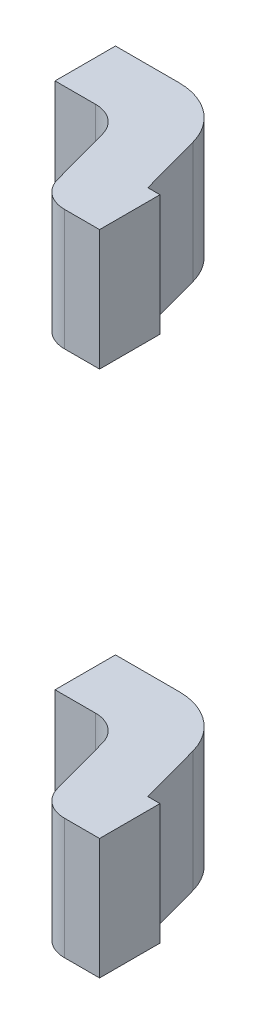
ISO-10303-21;
HEADER;
FILE_DESCRIPTION(('STEP AP214'),'2;1');
FILE_NAME('part.step','',(''),(''),'','','');
FILE_SCHEMA(('AUTOMOTIVE_DESIGN { 1 0 10303 214 1 1 1 1 }'));
ENDSEC;
DATA;
#1=APPLICATION_CONTEXT('core data for automotive mechanical design processes');
#2=APPLICATION_PROTOCOL_DEFINITION('international standard','automotive_design',2000,#1);
#3=PRODUCT_CONTEXT('',#1,'mechanical');
#4=PRODUCT('Part','Part','',(#3));
#5=PRODUCT_RELATED_PRODUCT_CATEGORY('part','',(#4));
#6=PRODUCT_DEFINITION_FORMATION('','',#4);
#7=PRODUCT_DEFINITION_CONTEXT('part definition',#1,'design');
#8=PRODUCT_DEFINITION('design','',#6,#7);
#9=PRODUCT_DEFINITION_SHAPE('','',#8);
#10=(LENGTH_UNIT() NAMED_UNIT(*) SI_UNIT(.MILLI.,.METRE.));
#11=(NAMED_UNIT(*) PLANE_ANGLE_UNIT() SI_UNIT($,.RADIAN.));
#12=(NAMED_UNIT(*) SI_UNIT($,.STERADIAN.) SOLID_ANGLE_UNIT());
#13=UNCERTAINTY_MEASURE_WITH_UNIT(LENGTH_MEASURE(1.E-05),#10,'distance_accuracy_value','');
#14=(GEOMETRIC_REPRESENTATION_CONTEXT(3) GLOBAL_UNCERTAINTY_ASSIGNED_CONTEXT((#13)) GLOBAL_UNIT_ASSIGNED_CONTEXT((#10,
#11,#12)) REPRESENTATION_CONTEXT('',''));
#15=CARTESIAN_POINT('',(0.,0.,0.));
#16=DIRECTION('',(0.,0.,1.));
#17=DIRECTION('',(1.,0.,0.));
#18=AXIS2_PLACEMENT_3D('',#15,#16,#17);
#19=CARTESIAN_POINT('',(-0.898916234097,-1.18,0.269792734049));
#20=DIRECTION('',(0.,-1.,0.));
#21=DIRECTION('',(1.,0.,0.));
#22=AXIS2_PLACEMENT_3D('',#19,#20,#21);
#23=PLANE('',#22);
#24=DIRECTION('',(1.,0.,0.));
#25=VECTOR('',#24,1.);
#26=CARTESIAN_POINT('',(-1.2,-1.18,0.22));
#27=LINE('',#26,#25);
#28=CARTESIAN_POINT('',(-1.2,-1.18,0.22));
#29=VERTEX_POINT('',#28);
#30=CARTESIAN_POINT('',(-1.05205262753,-1.18,0.22));
#31=VERTEX_POINT('',#30);
#32=EDGE_CURVE('P0_E86',#29,#31,#27,.T.);
#33=ORIENTED_EDGE('',*,*,#32,.F.);
#34=DIRECTION('',(0.,0.,-1.));
#35=VECTOR('',#34,1.);
#36=CARTESIAN_POINT('',(-1.2,-1.18,0.));
#37=LINE('',#36,#35);
#38=CARTESIAN_POINT('',(-1.2,-1.18,0.));
#39=VERTEX_POINT('',#38);
#40=EDGE_CURVE('P0_E92',#29,#39,#37,.T.);
#41=ORIENTED_EDGE('',*,*,#40,.T.);
#42=DIRECTION('',(1.,0.,0.));
#43=VECTOR('',#42,1.);
#44=CARTESIAN_POINT('',(-1.2,-1.18,0.));
#45=LINE('',#44,#43);
#46=CARTESIAN_POINT('',(-0.96803508502,-1.18,0.));
#47=VERTEX_POINT('',#46);
#48=EDGE_CURVE('P0_E178',#39,#47,#45,.T.);
#49=ORIENTED_EDGE('',*,*,#48,.T.);
#50=CARTESIAN_POINT('',(-0.96803508502,-1.18,0.22));
#51=DIRECTION('',(0.,1.,0.));
#52=DIRECTION('',(0.,0.,1.));
#53=AXIS2_PLACEMENT_3D('',#50,#51,#52);
#54=CIRCLE('',#53,0.22);
#55=CARTESIAN_POINT('',(-0.755787044347605,-1.18,0.162114170725821));
#56=VERTEX_POINT('',#55);
#57=EDGE_CURVE('P0_E204',#56,#47,#54,.T.);
#58=ORIENTED_EDGE('',*,*,#57,.F.);
#59=DIRECTION('',(-0.26311740579194,0.,-0.964763821237778));
#60=VECTOR('',#59,1.);
#61=CARTESIAN_POINT('',(-0.8,-1.18,0.));
#62=LINE('',#61,#60);
#63=CARTESIAN_POINT('',(-0.694212955652576,-1.18,0.387885829274105));
#64=VERTEX_POINT('',#63);
#65=EDGE_CURVE('P0_E121',#64,#56,#62,.T.);
#66=ORIENTED_EDGE('',*,*,#65,.F.);
#67=DIRECTION('',(1.,0.,0.));
#68=VECTOR('',#67,1.);
#69=CARTESIAN_POINT('',(-0.862248040672,-1.18,0.387885829274));
#70=LINE('',#69,#68);
#71=CARTESIAN_POINT('',(-0.65,-1.18,0.387885829274));
#72=VERTEX_POINT('',#71);
#73=EDGE_CURVE('P0_E122',#64,#72,#70,.T.);
#74=ORIENTED_EDGE('',*,*,#73,.T.);
#75=DIRECTION('',(0.,0.,-1.));
#76=VECTOR('',#75,1.);
#77=CARTESIAN_POINT('',(-0.65,-1.18,0.387885829274));
#78=LINE('',#77,#76);
#79=CARTESIAN_POINT('',(-0.65,-1.18,0.607885829274));
#80=VERTEX_POINT('',#79);
#81=EDGE_CURVE('P0_E118',#80,#72,#78,.T.);
#82=ORIENTED_EDGE('',*,*,#81,.F.);
#83=DIRECTION('',(1.,0.,0.));
#84=VECTOR('',#83,1.);
#85=CARTESIAN_POINT('',(-0.862248040672,-1.18,0.607885829274));
#86=LINE('',#85,#84);
#87=CARTESIAN_POINT('',(-0.778230498162,-1.18,0.607885829274));
#88=VERTEX_POINT('',#87);
#89=EDGE_CURVE('P0_E151',#88,#80,#86,.T.);
#90=ORIENTED_EDGE('',*,*,#89,.F.);
#91=CARTESIAN_POINT('',(-0.778230498162,-1.18,0.497885829274));
#92=DIRECTION('',(0.,1.,0.));
#93=DIRECTION('',(0.,0.,1.));
#94=AXIS2_PLACEMENT_3D('',#91,#92,#93);
#95=CIRCLE('',#94,0.11);
#96=CARTESIAN_POINT('',(-0.884354518498314,-1.18,0.526828743910984));
#97=VERTEX_POINT('',#96);
#98=EDGE_CURVE('P0_E155',#97,#88,#95,.T.);
#99=ORIENTED_EDGE('',*,*,#98,.F.);
#100=DIRECTION('',(-0.26311740579194,0.,-0.964763821237778));
#101=VECTOR('',#100,1.);
#102=CARTESIAN_POINT('',(-1.012248040672,-1.18,0.05788582927426));
#103=LINE('',#102,#101);
#104=CARTESIAN_POINT('',(-0.945928607193356,-1.18,0.301057085362789));
#105=VERTEX_POINT('',#104);
#106=EDGE_CURVE('P0_E79',#97,#105,#103,.T.);
#107=ORIENTED_EDGE('',*,*,#106,.T.);
#108=CARTESIAN_POINT('',(-1.05205262753,-1.18,0.33));
#109=DIRECTION('',(0.,1.,0.));
#110=DIRECTION('',(0.,0.,1.));
#111=AXIS2_PLACEMENT_3D('',#108,#109,#110);
#112=CIRCLE('',#111,0.11);
#113=EDGE_CURVE('P0_E20',#105,#31,#112,.T.);
#114=ORIENTED_EDGE('',*,*,#113,.T.);
#115=EDGE_LOOP('',(#33,#41,#49,#58,#66,#74,#82,#90,#99,#107,#114));
#116=FACE_BOUND('',#115,.T.);
#117=ADVANCED_FACE('P0_F17',(#116),#23,.T.);
#118=CARTESIAN_POINT('',(-1.2,-1.18,0.));
#119=DIRECTION('',(0.,0.,1.));
#120=DIRECTION('',(1.,0.,0.));
#121=AXIS2_PLACEMENT_3D('',#118,#119,#120);
#122=PLANE('',#121);
#123=ORIENTED_EDGE('',*,*,#48,.F.);
#124=DIRECTION('',(0.,1.,0.));
#125=VECTOR('',#124,1.);
#126=CARTESIAN_POINT('',(-1.2,-1.18,0.));
#127=LINE('',#126,#125);
#128=CARTESIAN_POINT('',(-1.2,-0.74,0.));
#129=VERTEX_POINT('',#128);
#130=EDGE_CURVE('P0_E162',#39,#129,#127,.T.);
#131=ORIENTED_EDGE('',*,*,#130,.T.);
#132=DIRECTION('',(1.,0.,0.));
#133=VECTOR('',#132,1.);
#134=CARTESIAN_POINT('',(-0.898916234097,-0.74,0.));
#135=LINE('',#134,#133);
#136=CARTESIAN_POINT('',(-0.96803508502,-0.74,0.));
#137=VERTEX_POINT('',#136);
#138=EDGE_CURVE('P0_E169',#137,#129,#135,.F.);
#139=ORIENTED_EDGE('',*,*,#138,.F.);
#140=DIRECTION('',(0.,1.,0.));
#141=VECTOR('',#140,1.);
#142=CARTESIAN_POINT('',(-0.96803508502,-1.18,0.));
#143=LINE('',#142,#141);
#144=EDGE_CURVE('P0_E229',#47,#137,#143,.T.);
#145=ORIENTED_EDGE('',*,*,#144,.F.);
#146=EDGE_LOOP('',(#123,#131,#139,#145));
#147=FACE_BOUND('',#146,.T.);
#148=ADVANCED_FACE('P0_F247',(#147),#122,.F.);
#149=CARTESIAN_POINT('',(-1.2,-1.18,0.));
#150=DIRECTION('',(1.,0.,0.));
#151=DIRECTION('',(0.,0.,-1.));
#152=AXIS2_PLACEMENT_3D('',#149,#150,#151);
#153=PLANE('',#152);
#154=DIRECTION('',(0.,0.,1.));
#155=VECTOR('',#154,1.);
#156=CARTESIAN_POINT('',(-1.2,-0.74,0.269792734049));
#157=LINE('',#156,#155);
#158=CARTESIAN_POINT('',(-1.2,-0.74,0.22));
#159=VERTEX_POINT('',#158);
#160=EDGE_CURVE('P0_E165',#129,#159,#157,.T.);
#161=ORIENTED_EDGE('',*,*,#160,.F.);
#162=ORIENTED_EDGE('',*,*,#130,.F.);
#163=ORIENTED_EDGE('',*,*,#40,.F.);
#164=DIRECTION('',(0.,1.,0.));
#165=VECTOR('',#164,1.);
#166=CARTESIAN_POINT('',(-1.2,-1.18,0.22));
#167=LINE('',#166,#165);
#168=EDGE_CURVE('P0_E160',#159,#29,#167,.F.);
#169=ORIENTED_EDGE('',*,*,#168,.F.);
#170=EDGE_LOOP('',(#161,#162,#163,#169));
#171=FACE_BOUND('',#170,.T.);
#172=ADVANCED_FACE('P0_F249',(#171),#153,.F.);
#173=CARTESIAN_POINT('',(-1.2,-1.18,0.22));
#174=DIRECTION('',(0.,0.,1.));
#175=DIRECTION('',(1.,0.,0.));
#176=AXIS2_PLACEMENT_3D('',#173,#174,#175);
#177=PLANE('',#176);
#178=ORIENTED_EDGE('',*,*,#32,.T.);
#179=DIRECTION('',(0.,1.,0.));
#180=VECTOR('',#179,1.);
#181=CARTESIAN_POINT('',(-1.05205262753,-1.18,0.22));
#182=LINE('',#181,#180);
#183=CARTESIAN_POINT('',(-1.05205262753,-0.74,0.22));
#184=VERTEX_POINT('',#183);
#185=EDGE_CURVE('P0_E158',#31,#184,#182,.T.);
#186=ORIENTED_EDGE('',*,*,#185,.T.);
#187=DIRECTION('',(1.,0.,0.));
#188=VECTOR('',#187,1.);
#189=CARTESIAN_POINT('',(-0.898916234097,-0.74,0.22));
#190=LINE('',#189,#188);
#191=EDGE_CURVE('P0_E168',#159,#184,#190,.T.);
#192=ORIENTED_EDGE('',*,*,#191,.F.);
#193=ORIENTED_EDGE('',*,*,#168,.T.);
#194=EDGE_LOOP('',(#178,#186,#192,#193));
#195=FACE_BOUND('',#194,.T.);
#196=ADVANCED_FACE('P0_F251',(#195),#177,.T.);
#197=CARTESIAN_POINT('',(-1.05205262753,-1.18,0.33));
#198=DIRECTION('',(0.,1.,0.));
#199=DIRECTION('',(0.,0.,1.));
#200=AXIS2_PLACEMENT_3D('',#197,#198,#199);
#201=CYLINDRICAL_SURFACE('',#200,0.11);
#202=DIRECTION('',(0.,1.,0.));
#203=VECTOR('',#202,1.);
#204=CARTESIAN_POINT('',(-0.945928607193347,-1.18,0.301057085362822));
#205=LINE('',#204,#203);
#206=CARTESIAN_POINT('',(-0.945928607193691,-0.74,0.301057085362849));
#207=VERTEX_POINT('',#206);
#208=EDGE_CURVE('P0_E156',#105,#207,#205,.T.);
#209=ORIENTED_EDGE('',*,*,#208,.T.);
#210=CARTESIAN_POINT('',(-1.05205262753,-0.74,0.33));
#211=DIRECTION('',(0.,1.,0.));
#212=DIRECTION('',(0.,0.,1.));
#213=AXIS2_PLACEMENT_3D('',#210,#211,#212);
#214=CIRCLE('',#213,0.11);
#215=EDGE_CURVE('P0_E201',#184,#207,#214,.F.);
#216=ORIENTED_EDGE('',*,*,#215,.F.);
#217=ORIENTED_EDGE('',*,*,#185,.F.);
#218=ORIENTED_EDGE('',*,*,#113,.F.);
#219=EDGE_LOOP('',(#209,#216,#217,#218));
#220=FACE_BOUND('',#219,.T.);
#221=ADVANCED_FACE('P0_F254',(#220),#201,.F.);
#222=CARTESIAN_POINT('',(-1.012248040672,-1.18,0.05788582927426));
#223=DIRECTION('',(0.964763821237778,0.,-0.26311740579194));
#224=DIRECTION('',(-0.26311740579194,0.,-0.964763821237778));
#225=AXIS2_PLACEMENT_3D('',#222,#223,#224);
#226=PLANE('',#225);
#227=DIRECTION('',(0.26311740579247,0.,0.964763821237634));
#228=VECTOR('',#227,1.);
#229=CARTESIAN_POINT('',(-0.945928607194,-0.74,0.301057085363));
#230=LINE('',#229,#228);
#231=CARTESIAN_POINT('',(-0.88435451849857,-0.74,0.526828743911086));
#232=VERTEX_POINT('',#231);
#233=EDGE_CURVE('P0_E200',#207,#232,#230,.T.);
#234=ORIENTED_EDGE('',*,*,#233,.F.);
#235=ORIENTED_EDGE('',*,*,#208,.F.);
#236=ORIENTED_EDGE('',*,*,#106,.F.);
#237=DIRECTION('',(0.,1.,0.));
#238=VECTOR('',#237,1.);
#239=CARTESIAN_POINT('',(-0.884354518498243,-1.18,0.526828743910793));
#240=LINE('',#239,#238);
#241=EDGE_CURVE('P0_E152',#232,#97,#240,.F.);
#242=ORIENTED_EDGE('',*,*,#241,.F.);
#243=EDGE_LOOP('',(#234,#235,#236,#242));
#244=FACE_BOUND('',#243,.T.);
#245=ADVANCED_FACE('P0_F255',(#244),#226,.F.);
#246=CARTESIAN_POINT('',(-0.778230498162,-1.18,0.497885829274));
#247=DIRECTION('',(0.,1.,0.));
#248=DIRECTION('',(0.,0.,1.));
#249=AXIS2_PLACEMENT_3D('',#246,#247,#248);
#250=CYLINDRICAL_SURFACE('',#249,0.11);
#251=CARTESIAN_POINT('',(-0.778230498162,-0.74,0.497885829274));
#252=DIRECTION('',(0.,1.,0.));
#253=DIRECTION('',(0.,0.,1.));
#254=AXIS2_PLACEMENT_3D('',#251,#252,#253);
#255=CIRCLE('',#254,0.11);
#256=CARTESIAN_POINT('',(-0.778230498162,-0.74,0.607885829274));
#257=VERTEX_POINT('',#256);
#258=EDGE_CURVE('P0_E137',#232,#257,#255,.T.);
#259=ORIENTED_EDGE('',*,*,#258,.F.);
#260=ORIENTED_EDGE('',*,*,#241,.T.);
#261=ORIENTED_EDGE('',*,*,#98,.T.);
#262=DIRECTION('',(0.,1.,0.));
#263=VECTOR('',#262,1.);
#264=CARTESIAN_POINT('',(-0.778230498162,-1.18,0.607885829274));
#265=LINE('',#264,#263);
#266=EDGE_CURVE('P0_E148',#257,#88,#265,.F.);
#267=ORIENTED_EDGE('',*,*,#266,.F.);
#268=EDGE_LOOP('',(#259,#260,#261,#267));
#269=FACE_BOUND('',#268,.T.);
#270=ADVANCED_FACE('P0_F209',(#269),#250,.T.);
#271=CARTESIAN_POINT('',(-0.862248040672,-1.18,0.607885829274));
#272=DIRECTION('',(0.,0.,1.));
#273=DIRECTION('',(1.,0.,0.));
#274=AXIS2_PLACEMENT_3D('',#271,#272,#273);
#275=PLANE('',#274);
#276=DIRECTION('',(1.,0.,0.));
#277=VECTOR('',#276,1.);
#278=CARTESIAN_POINT('',(-0.898916234097,-0.74,0.607885829274));
#279=LINE('',#278,#277);
#280=CARTESIAN_POINT('',(-0.65,-0.74,0.607885829274));
#281=VERTEX_POINT('',#280);
#282=EDGE_CURVE('P0_E135',#257,#281,#279,.T.);
#283=ORIENTED_EDGE('',*,*,#282,.F.);
#284=ORIENTED_EDGE('',*,*,#266,.T.);
#285=ORIENTED_EDGE('',*,*,#89,.T.);
#286=DIRECTION('',(0.,1.,0.));
#287=VECTOR('',#286,1.);
#288=CARTESIAN_POINT('',(-0.65,-1.18,0.607885829274));
#289=LINE('',#288,#287);
#290=EDGE_CURVE('P0_E144',#281,#80,#289,.F.);
#291=ORIENTED_EDGE('',*,*,#290,.F.);
#292=EDGE_LOOP('',(#283,#284,#285,#291));
#293=FACE_BOUND('',#292,.T.);
#294=ADVANCED_FACE('P0_F211',(#293),#275,.T.);
#295=CARTESIAN_POINT('',(-0.65,-1.18,0.387885829274));
#296=DIRECTION('',(1.,0.,0.));
#297=DIRECTION('',(0.,0.,-1.));
#298=AXIS2_PLACEMENT_3D('',#295,#296,#297);
#299=PLANE('',#298);
#300=DIRECTION('',(0.,0.,1.));
#301=VECTOR('',#300,1.);
#302=CARTESIAN_POINT('',(-0.65,-0.74,0.269792734049));
#303=LINE('',#302,#301);
#304=CARTESIAN_POINT('',(-0.65,-0.74,0.387885829274));
#305=VERTEX_POINT('',#304);
#306=EDGE_CURVE('P0_E116',#281,#305,#303,.F.);
#307=ORIENTED_EDGE('',*,*,#306,.F.);
#308=ORIENTED_EDGE('',*,*,#290,.T.);
#309=ORIENTED_EDGE('',*,*,#81,.T.);
#310=DIRECTION('',(0.,1.,0.));
#311=VECTOR('',#310,1.);
#312=CARTESIAN_POINT('',(-0.65,-1.18,0.387885829274));
#313=LINE('',#312,#311);
#314=EDGE_CURVE('P0_E111',#72,#305,#313,.T.);
#315=ORIENTED_EDGE('',*,*,#314,.T.);
#316=EDGE_LOOP('',(#307,#308,#309,#315));
#317=FACE_BOUND('',#316,.T.);
#318=ADVANCED_FACE('P0_F113',(#317),#299,.T.);
#319=CARTESIAN_POINT('',(-0.862248040672,-1.18,0.387885829274));
#320=DIRECTION('',(0.,0.,1.));
#321=DIRECTION('',(1.,0.,0.));
#322=AXIS2_PLACEMENT_3D('',#319,#320,#321);
#323=PLANE('',#322);
#324=ORIENTED_EDGE('',*,*,#73,.F.);
#325=DIRECTION('',(0.,1.,0.));
#326=VECTOR('',#325,1.);
#327=CARTESIAN_POINT('',(-0.694212955652576,-1.18,0.387885829274157));
#328=LINE('',#327,#326);
#329=CARTESIAN_POINT('',(-0.694212955652192,-0.74,0.387885829274052));
#330=VERTEX_POINT('',#329);
#331=EDGE_CURVE('P0_E128',#330,#64,#328,.F.);
#332=ORIENTED_EDGE('',*,*,#331,.F.);
#333=DIRECTION('',(1.,0.,0.));
#334=VECTOR('',#333,1.);
#335=CARTESIAN_POINT('',(-0.898916234097,-0.74,0.387885829274));
#336=LINE('',#335,#334);
#337=EDGE_CURVE('P0_E125',#305,#330,#336,.F.);
#338=ORIENTED_EDGE('',*,*,#337,.F.);
#339=ORIENTED_EDGE('',*,*,#314,.F.);
#340=EDGE_LOOP('',(#324,#332,#338,#339));
#341=FACE_BOUND('',#340,.T.);
#342=ADVANCED_FACE('P0_F126',(#341),#323,.F.);
#343=CARTESIAN_POINT('',(-0.8,-1.18,0.));
#344=DIRECTION('',(0.964763821237778,0.,-0.26311740579194));
#345=DIRECTION('',(-0.26311740579194,0.,-0.964763821237778));
#346=AXIS2_PLACEMENT_3D('',#343,#344,#345);
#347=PLANE('',#346);
#348=DIRECTION('',(-0.263117405796448,0.,-0.964763821236549));
#349=VECTOR('',#348,1.);
#350=CARTESIAN_POINT('',(-0.694212955652,-0.74,0.387885829274));
#351=LINE('',#350,#349);
#352=CARTESIAN_POINT('',(-0.75578704434798,-0.74,0.162114170725391));
#353=VERTEX_POINT('',#352);
#354=EDGE_CURVE('P0_E26',#330,#353,#351,.T.);
#355=ORIENTED_EDGE('',*,*,#354,.F.);
#356=ORIENTED_EDGE('',*,*,#331,.T.);
#357=ORIENTED_EDGE('',*,*,#65,.T.);
#358=DIRECTION('',(0.,1.,0.));
#359=VECTOR('',#358,1.);
#360=CARTESIAN_POINT('',(-0.755787044347653,-1.18,0.162114170725905));
#361=LINE('',#360,#359);
#362=EDGE_CURVE('P0_E35',#353,#56,#361,.F.);
#363=ORIENTED_EDGE('',*,*,#362,.F.);
#364=EDGE_LOOP('',(#355,#356,#357,#363));
#365=FACE_BOUND('',#364,.T.);
#366=ADVANCED_FACE('P0_F237',(#365),#347,.T.);
#367=CARTESIAN_POINT('',(-0.96803508502,-1.18,0.22));
#368=DIRECTION('',(0.,1.,0.));
#369=DIRECTION('',(0.,0.,1.));
#370=AXIS2_PLACEMENT_3D('',#367,#368,#369);
#371=CYLINDRICAL_SURFACE('',#370,0.22);
#372=ORIENTED_EDGE('',*,*,#362,.T.);
#373=ORIENTED_EDGE('',*,*,#57,.T.);
#374=ORIENTED_EDGE('',*,*,#144,.T.);
#375=CARTESIAN_POINT('',(-0.96803508502,-0.74,0.22));
#376=DIRECTION('',(0.,1.,0.));
#377=DIRECTION('',(0.,0.,1.));
#378=AXIS2_PLACEMENT_3D('',#375,#376,#377);
#379=CIRCLE('',#378,0.22);
#380=EDGE_CURVE('P0_E11',#353,#137,#379,.T.);
#381=ORIENTED_EDGE('',*,*,#380,.F.);
#382=EDGE_LOOP('',(#372,#373,#374,#381));
#383=FACE_BOUND('',#382,.T.);
#384=ADVANCED_FACE('P0_F243',(#383),#371,.T.);
#385=CARTESIAN_POINT('',(-0.898916234097,-0.74,0.269792734049));
#386=DIRECTION('',(0.,1.,0.));
#387=DIRECTION('',(0.,0.,1.));
#388=AXIS2_PLACEMENT_3D('',#385,#386,#387);
#389=PLANE('',#388);
#390=ORIENTED_EDGE('',*,*,#354,.T.);
#391=ORIENTED_EDGE('',*,*,#380,.T.);
#392=ORIENTED_EDGE('',*,*,#138,.T.);
#393=ORIENTED_EDGE('',*,*,#160,.T.);
#394=ORIENTED_EDGE('',*,*,#191,.T.);
#395=ORIENTED_EDGE('',*,*,#215,.T.);
#396=ORIENTED_EDGE('',*,*,#233,.T.);
#397=ORIENTED_EDGE('',*,*,#258,.T.);
#398=ORIENTED_EDGE('',*,*,#282,.T.);
#399=ORIENTED_EDGE('',*,*,#306,.T.);
#400=ORIENTED_EDGE('',*,*,#337,.T.);
#401=EDGE_LOOP('',(#390,#391,#392,#393,#394,#395,#396,#397,#398,#399,#400));
#402=FACE_BOUND('',#401,.T.);
#403=ADVANCED_FACE('P0_F132',(#402),#389,.T.);
#404=CLOSED_SHELL('',(#117,#148,#172,#196,#221,#245,#270,#294,#318,#342,#366,#384,#403));
#405=MANIFOLD_SOLID_BREP('P0_B1',#404);
#406=CARTESIAN_POINT('',(-0.898916234097,0.74,0.269792734049));
#407=DIRECTION('',(0.,-1.,0.));
#408=DIRECTION('',(1.,0.,0.));
#409=AXIS2_PLACEMENT_3D('',#406,#407,#408);
#410=PLANE('',#409);
#411=DIRECTION('',(1.,0.,0.));
#412=VECTOR('',#411,1.);
#413=CARTESIAN_POINT('',(-1.2,0.74,0.22));
#414=LINE('',#413,#412);
#415=CARTESIAN_POINT('',(-1.2,0.74,0.22));
#416=VERTEX_POINT('',#415);
#417=CARTESIAN_POINT('',(-1.05205262753,0.74,0.22));
#418=VERTEX_POINT('',#417);
#419=EDGE_CURVE('P1_E86',#416,#418,#414,.T.);
#420=ORIENTED_EDGE('',*,*,#419,.F.);
#421=DIRECTION('',(0.,0.,-1.));
#422=VECTOR('',#421,1.);
#423=CARTESIAN_POINT('',(-1.2,0.74,0.));
#424=LINE('',#423,#422);
#425=CARTESIAN_POINT('',(-1.2,0.74,0.));
#426=VERTEX_POINT('',#425);
#427=EDGE_CURVE('P1_E92',#416,#426,#424,.T.);
#428=ORIENTED_EDGE('',*,*,#427,.T.);
#429=DIRECTION('',(1.,0.,0.));
#430=VECTOR('',#429,1.);
#431=CARTESIAN_POINT('',(-1.2,0.74,0.));
#432=LINE('',#431,#430);
#433=CARTESIAN_POINT('',(-0.96803508502,0.74,0.));
#434=VERTEX_POINT('',#433);
#435=EDGE_CURVE('P1_E178',#426,#434,#432,.T.);
#436=ORIENTED_EDGE('',*,*,#435,.T.);
#437=CARTESIAN_POINT('',(-0.96803508502,0.74,0.22));
#438=DIRECTION('',(0.,1.,0.));
#439=DIRECTION('',(0.,0.,1.));
#440=AXIS2_PLACEMENT_3D('',#437,#438,#439);
#441=CIRCLE('',#440,0.22);
#442=CARTESIAN_POINT('',(-0.755787044347605,0.74,0.162114170725821));
#443=VERTEX_POINT('',#442);
#444=EDGE_CURVE('P1_E204',#443,#434,#441,.T.);
#445=ORIENTED_EDGE('',*,*,#444,.F.);
#446=DIRECTION('',(-0.26311740579194,0.,-0.964763821237778));
#447=VECTOR('',#446,1.);
#448=CARTESIAN_POINT('',(-0.8,0.74,0.));
#449=LINE('',#448,#447);
#450=CARTESIAN_POINT('',(-0.694212955652576,0.74,0.387885829274105));
#451=VERTEX_POINT('',#450);
#452=EDGE_CURVE('P1_E121',#451,#443,#449,.T.);
#453=ORIENTED_EDGE('',*,*,#452,.F.);
#454=DIRECTION('',(1.,0.,0.));
#455=VECTOR('',#454,1.);
#456=CARTESIAN_POINT('',(-0.862248040672,0.74,0.387885829274));
#457=LINE('',#456,#455);
#458=CARTESIAN_POINT('',(-0.65,0.74,0.387885829274));
#459=VERTEX_POINT('',#458);
#460=EDGE_CURVE('P1_E122',#451,#459,#457,.T.);
#461=ORIENTED_EDGE('',*,*,#460,.T.);
#462=DIRECTION('',(0.,0.,-1.));
#463=VECTOR('',#462,1.);
#464=CARTESIAN_POINT('',(-0.65,0.74,0.387885829274));
#465=LINE('',#464,#463);
#466=CARTESIAN_POINT('',(-0.65,0.74,0.607885829274));
#467=VERTEX_POINT('',#466);
#468=EDGE_CURVE('P1_E118',#467,#459,#465,.T.);
#469=ORIENTED_EDGE('',*,*,#468,.F.);
#470=DIRECTION('',(1.,0.,0.));
#471=VECTOR('',#470,1.);
#472=CARTESIAN_POINT('',(-0.862248040672,0.74,0.607885829274));
#473=LINE('',#472,#471);
#474=CARTESIAN_POINT('',(-0.778230498162,0.74,0.607885829274));
#475=VERTEX_POINT('',#474);
#476=EDGE_CURVE('P1_E151',#475,#467,#473,.T.);
#477=ORIENTED_EDGE('',*,*,#476,.F.);
#478=CARTESIAN_POINT('',(-0.778230498162,0.74,0.497885829274));
#479=DIRECTION('',(0.,1.,0.));
#480=DIRECTION('',(0.,0.,1.));
#481=AXIS2_PLACEMENT_3D('',#478,#479,#480);
#482=CIRCLE('',#481,0.11);
#483=CARTESIAN_POINT('',(-0.884354518498314,0.74,0.526828743910984));
#484=VERTEX_POINT('',#483);
#485=EDGE_CURVE('P1_E155',#484,#475,#482,.T.);
#486=ORIENTED_EDGE('',*,*,#485,.F.);
#487=DIRECTION('',(-0.26311740579194,0.,-0.964763821237778));
#488=VECTOR('',#487,1.);
#489=CARTESIAN_POINT('',(-1.012248040672,0.74,0.05788582927426));
#490=LINE('',#489,#488);
#491=CARTESIAN_POINT('',(-0.945928607193356,0.74,0.301057085362789));
#492=VERTEX_POINT('',#491);
#493=EDGE_CURVE('P1_E79',#484,#492,#490,.T.);
#494=ORIENTED_EDGE('',*,*,#493,.T.);
#495=CARTESIAN_POINT('',(-1.05205262753,0.74,0.33));
#496=DIRECTION('',(0.,1.,0.));
#497=DIRECTION('',(0.,0.,1.));
#498=AXIS2_PLACEMENT_3D('',#495,#496,#497);
#499=CIRCLE('',#498,0.11);
#500=EDGE_CURVE('P1_E20',#492,#418,#499,.T.);
#501=ORIENTED_EDGE('',*,*,#500,.T.);
#502=EDGE_LOOP('',(#420,#428,#436,#445,#453,#461,#469,#477,#486,#494,#501));
#503=FACE_BOUND('',#502,.T.);
#504=ADVANCED_FACE('P1_F17',(#503),#410,.T.);
#505=CARTESIAN_POINT('',(-1.2,0.74,0.));
#506=DIRECTION('',(0.,0.,1.));
#507=DIRECTION('',(1.,0.,0.));
#508=AXIS2_PLACEMENT_3D('',#505,#506,#507);
#509=PLANE('',#508);
#510=ORIENTED_EDGE('',*,*,#435,.F.);
#511=DIRECTION('',(0.,1.,0.));
#512=VECTOR('',#511,1.);
#513=CARTESIAN_POINT('',(-1.2,0.74,0.));
#514=LINE('',#513,#512);
#515=CARTESIAN_POINT('',(-1.2,1.18,0.));
#516=VERTEX_POINT('',#515);
#517=EDGE_CURVE('P1_E162',#426,#516,#514,.T.);
#518=ORIENTED_EDGE('',*,*,#517,.T.);
#519=DIRECTION('',(1.,0.,0.));
#520=VECTOR('',#519,1.);
#521=CARTESIAN_POINT('',(-0.898916234097,1.18,0.));
#522=LINE('',#521,#520);
#523=CARTESIAN_POINT('',(-0.96803508502,1.18,0.));
#524=VERTEX_POINT('',#523);
#525=EDGE_CURVE('P1_E169',#524,#516,#522,.F.);
#526=ORIENTED_EDGE('',*,*,#525,.F.);
#527=DIRECTION('',(0.,1.,0.));
#528=VECTOR('',#527,1.);
#529=CARTESIAN_POINT('',(-0.96803508502,0.74,0.));
#530=LINE('',#529,#528);
#531=EDGE_CURVE('P1_E229',#434,#524,#530,.T.);
#532=ORIENTED_EDGE('',*,*,#531,.F.);
#533=EDGE_LOOP('',(#510,#518,#526,#532));
#534=FACE_BOUND('',#533,.T.);
#535=ADVANCED_FACE('P1_F247',(#534),#509,.F.);
#536=CARTESIAN_POINT('',(-1.2,0.74,0.));
#537=DIRECTION('',(1.,0.,0.));
#538=DIRECTION('',(0.,0.,-1.));
#539=AXIS2_PLACEMENT_3D('',#536,#537,#538);
#540=PLANE('',#539);
#541=DIRECTION('',(0.,0.,1.));
#542=VECTOR('',#541,1.);
#543=CARTESIAN_POINT('',(-1.2,1.18,0.269792734049));
#544=LINE('',#543,#542);
#545=CARTESIAN_POINT('',(-1.2,1.18,0.22));
#546=VERTEX_POINT('',#545);
#547=EDGE_CURVE('P1_E165',#516,#546,#544,.T.);
#548=ORIENTED_EDGE('',*,*,#547,.F.);
#549=ORIENTED_EDGE('',*,*,#517,.F.);
#550=ORIENTED_EDGE('',*,*,#427,.F.);
#551=DIRECTION('',(0.,1.,0.));
#552=VECTOR('',#551,1.);
#553=CARTESIAN_POINT('',(-1.2,0.74,0.22));
#554=LINE('',#553,#552);
#555=EDGE_CURVE('P1_E160',#546,#416,#554,.F.);
#556=ORIENTED_EDGE('',*,*,#555,.F.);
#557=EDGE_LOOP('',(#548,#549,#550,#556));
#558=FACE_BOUND('',#557,.T.);
#559=ADVANCED_FACE('P1_F249',(#558),#540,.F.);
#560=CARTESIAN_POINT('',(-1.2,0.74,0.22));
#561=DIRECTION('',(0.,0.,1.));
#562=DIRECTION('',(1.,0.,0.));
#563=AXIS2_PLACEMENT_3D('',#560,#561,#562);
#564=PLANE('',#563);
#565=ORIENTED_EDGE('',*,*,#419,.T.);
#566=DIRECTION('',(0.,1.,0.));
#567=VECTOR('',#566,1.);
#568=CARTESIAN_POINT('',(-1.05205262753,0.74,0.22));
#569=LINE('',#568,#567);
#570=CARTESIAN_POINT('',(-1.05205262753,1.18,0.22));
#571=VERTEX_POINT('',#570);
#572=EDGE_CURVE('P1_E158',#418,#571,#569,.T.);
#573=ORIENTED_EDGE('',*,*,#572,.T.);
#574=DIRECTION('',(1.,0.,0.));
#575=VECTOR('',#574,1.);
#576=CARTESIAN_POINT('',(-0.898916234097,1.18,0.22));
#577=LINE('',#576,#575);
#578=EDGE_CURVE('P1_E168',#546,#571,#577,.T.);
#579=ORIENTED_EDGE('',*,*,#578,.F.);
#580=ORIENTED_EDGE('',*,*,#555,.T.);
#581=EDGE_LOOP('',(#565,#573,#579,#580));
#582=FACE_BOUND('',#581,.T.);
#583=ADVANCED_FACE('P1_F251',(#582),#564,.T.);
#584=CARTESIAN_POINT('',(-1.05205262753,0.74,0.33));
#585=DIRECTION('',(0.,1.,0.));
#586=DIRECTION('',(0.,0.,1.));
#587=AXIS2_PLACEMENT_3D('',#584,#585,#586);
#588=CYLINDRICAL_SURFACE('',#587,0.11);
#589=DIRECTION('',(0.,1.,0.));
#590=VECTOR('',#589,1.);
#591=CARTESIAN_POINT('',(-0.945928607193347,0.74,0.301057085362822));
#592=LINE('',#591,#590);
#593=CARTESIAN_POINT('',(-0.945928607193691,1.18,0.301057085362849));
#594=VERTEX_POINT('',#593);
#595=EDGE_CURVE('P1_E156',#492,#594,#592,.T.);
#596=ORIENTED_EDGE('',*,*,#595,.T.);
#597=CARTESIAN_POINT('',(-1.05205262753,1.18,0.33));
#598=DIRECTION('',(0.,1.,0.));
#599=DIRECTION('',(0.,0.,1.));
#600=AXIS2_PLACEMENT_3D('',#597,#598,#599);
#601=CIRCLE('',#600,0.11);
#602=EDGE_CURVE('P1_E201',#571,#594,#601,.F.);
#603=ORIENTED_EDGE('',*,*,#602,.F.);
#604=ORIENTED_EDGE('',*,*,#572,.F.);
#605=ORIENTED_EDGE('',*,*,#500,.F.);
#606=EDGE_LOOP('',(#596,#603,#604,#605));
#607=FACE_BOUND('',#606,.T.);
#608=ADVANCED_FACE('P1_F254',(#607),#588,.F.);
#609=CARTESIAN_POINT('',(-1.012248040672,0.74,0.05788582927426));
#610=DIRECTION('',(0.964763821237778,0.,-0.26311740579194));
#611=DIRECTION('',(-0.26311740579194,0.,-0.964763821237778));
#612=AXIS2_PLACEMENT_3D('',#609,#610,#611);
#613=PLANE('',#612);
#614=DIRECTION('',(0.26311740579247,0.,0.964763821237634));
#615=VECTOR('',#614,1.);
#616=CARTESIAN_POINT('',(-0.945928607194,1.18,0.301057085363));
#617=LINE('',#616,#615);
#618=CARTESIAN_POINT('',(-0.88435451849857,1.18,0.526828743911086));
#619=VERTEX_POINT('',#618);
#620=EDGE_CURVE('P1_E200',#594,#619,#617,.T.);
#621=ORIENTED_EDGE('',*,*,#620,.F.);
#622=ORIENTED_EDGE('',*,*,#595,.F.);
#623=ORIENTED_EDGE('',*,*,#493,.F.);
#624=DIRECTION('',(0.,1.,0.));
#625=VECTOR('',#624,1.);
#626=CARTESIAN_POINT('',(-0.884354518498243,0.74,0.526828743910793));
#627=LINE('',#626,#625);
#628=EDGE_CURVE('P1_E152',#619,#484,#627,.F.);
#629=ORIENTED_EDGE('',*,*,#628,.F.);
#630=EDGE_LOOP('',(#621,#622,#623,#629));
#631=FACE_BOUND('',#630,.T.);
#632=ADVANCED_FACE('P1_F255',(#631),#613,.F.);
#633=CARTESIAN_POINT('',(-0.778230498162,0.74,0.497885829274));
#634=DIRECTION('',(0.,1.,0.));
#635=DIRECTION('',(0.,0.,1.));
#636=AXIS2_PLACEMENT_3D('',#633,#634,#635);
#637=CYLINDRICAL_SURFACE('',#636,0.11);
#638=CARTESIAN_POINT('',(-0.778230498162,1.18,0.497885829274));
#639=DIRECTION('',(0.,1.,0.));
#640=DIRECTION('',(0.,0.,1.));
#641=AXIS2_PLACEMENT_3D('',#638,#639,#640);
#642=CIRCLE('',#641,0.11);
#643=CARTESIAN_POINT('',(-0.778230498162,1.18,0.607885829274));
#644=VERTEX_POINT('',#643);
#645=EDGE_CURVE('P1_E137',#619,#644,#642,.T.);
#646=ORIENTED_EDGE('',*,*,#645,.F.);
#647=ORIENTED_EDGE('',*,*,#628,.T.);
#648=ORIENTED_EDGE('',*,*,#485,.T.);
#649=DIRECTION('',(0.,1.,0.));
#650=VECTOR('',#649,1.);
#651=CARTESIAN_POINT('',(-0.778230498162,0.74,0.607885829274));
#652=LINE('',#651,#650);
#653=EDGE_CURVE('P1_E148',#644,#475,#652,.F.);
#654=ORIENTED_EDGE('',*,*,#653,.F.);
#655=EDGE_LOOP('',(#646,#647,#648,#654));
#656=FACE_BOUND('',#655,.T.);
#657=ADVANCED_FACE('P1_F209',(#656),#637,.T.);
#658=CARTESIAN_POINT('',(-0.862248040672,0.74,0.607885829274));
#659=DIRECTION('',(0.,0.,1.));
#660=DIRECTION('',(1.,0.,0.));
#661=AXIS2_PLACEMENT_3D('',#658,#659,#660);
#662=PLANE('',#661);
#663=DIRECTION('',(1.,0.,0.));
#664=VECTOR('',#663,1.);
#665=CARTESIAN_POINT('',(-0.898916234097,1.18,0.607885829274));
#666=LINE('',#665,#664);
#667=CARTESIAN_POINT('',(-0.65,1.18,0.607885829274));
#668=VERTEX_POINT('',#667);
#669=EDGE_CURVE('P1_E135',#644,#668,#666,.T.);
#670=ORIENTED_EDGE('',*,*,#669,.F.);
#671=ORIENTED_EDGE('',*,*,#653,.T.);
#672=ORIENTED_EDGE('',*,*,#476,.T.);
#673=DIRECTION('',(0.,1.,0.));
#674=VECTOR('',#673,1.);
#675=CARTESIAN_POINT('',(-0.65,0.74,0.607885829274));
#676=LINE('',#675,#674);
#677=EDGE_CURVE('P1_E144',#668,#467,#676,.F.);
#678=ORIENTED_EDGE('',*,*,#677,.F.);
#679=EDGE_LOOP('',(#670,#671,#672,#678));
#680=FACE_BOUND('',#679,.T.);
#681=ADVANCED_FACE('P1_F211',(#680),#662,.T.);
#682=CARTESIAN_POINT('',(-0.65,0.74,0.387885829274));
#683=DIRECTION('',(1.,0.,0.));
#684=DIRECTION('',(0.,0.,-1.));
#685=AXIS2_PLACEMENT_3D('',#682,#683,#684);
#686=PLANE('',#685);
#687=DIRECTION('',(0.,0.,1.));
#688=VECTOR('',#687,1.);
#689=CARTESIAN_POINT('',(-0.65,1.18,0.269792734049));
#690=LINE('',#689,#688);
#691=CARTESIAN_POINT('',(-0.65,1.18,0.387885829274));
#692=VERTEX_POINT('',#691);
#693=EDGE_CURVE('P1_E116',#668,#692,#690,.F.);
#694=ORIENTED_EDGE('',*,*,#693,.F.);
#695=ORIENTED_EDGE('',*,*,#677,.T.);
#696=ORIENTED_EDGE('',*,*,#468,.T.);
#697=DIRECTION('',(0.,1.,0.));
#698=VECTOR('',#697,1.);
#699=CARTESIAN_POINT('',(-0.65,0.74,0.387885829274));
#700=LINE('',#699,#698);
#701=EDGE_CURVE('P1_E111',#459,#692,#700,.T.);
#702=ORIENTED_EDGE('',*,*,#701,.T.);
#703=EDGE_LOOP('',(#694,#695,#696,#702));
#704=FACE_BOUND('',#703,.T.);
#705=ADVANCED_FACE('P1_F113',(#704),#686,.T.);
#706=CARTESIAN_POINT('',(-0.862248040672,0.74,0.387885829274));
#707=DIRECTION('',(0.,0.,1.));
#708=DIRECTION('',(1.,0.,0.));
#709=AXIS2_PLACEMENT_3D('',#706,#707,#708);
#710=PLANE('',#709);
#711=ORIENTED_EDGE('',*,*,#460,.F.);
#712=DIRECTION('',(0.,1.,0.));
#713=VECTOR('',#712,1.);
#714=CARTESIAN_POINT('',(-0.694212955652576,0.74,0.387885829274157));
#715=LINE('',#714,#713);
#716=CARTESIAN_POINT('',(-0.694212955652192,1.18,0.387885829274052));
#717=VERTEX_POINT('',#716);
#718=EDGE_CURVE('P1_E128',#717,#451,#715,.F.);
#719=ORIENTED_EDGE('',*,*,#718,.F.);
#720=DIRECTION('',(1.,0.,0.));
#721=VECTOR('',#720,1.);
#722=CARTESIAN_POINT('',(-0.898916234097,1.18,0.387885829274));
#723=LINE('',#722,#721);
#724=EDGE_CURVE('P1_E125',#692,#717,#723,.F.);
#725=ORIENTED_EDGE('',*,*,#724,.F.);
#726=ORIENTED_EDGE('',*,*,#701,.F.);
#727=EDGE_LOOP('',(#711,#719,#725,#726));
#728=FACE_BOUND('',#727,.T.);
#729=ADVANCED_FACE('P1_F126',(#728),#710,.F.);
#730=CARTESIAN_POINT('',(-0.8,0.74,0.));
#731=DIRECTION('',(0.964763821237778,0.,-0.26311740579194));
#732=DIRECTION('',(-0.26311740579194,0.,-0.964763821237778));
#733=AXIS2_PLACEMENT_3D('',#730,#731,#732);
#734=PLANE('',#733);
#735=DIRECTION('',(-0.263117405796448,0.,-0.964763821236549));
#736=VECTOR('',#735,1.);
#737=CARTESIAN_POINT('',(-0.694212955652,1.18,0.387885829274));
#738=LINE('',#737,#736);
#739=CARTESIAN_POINT('',(-0.75578704434798,1.18,0.162114170725391));
#740=VERTEX_POINT('',#739);
#741=EDGE_CURVE('P1_E26',#717,#740,#738,.T.);
#742=ORIENTED_EDGE('',*,*,#741,.F.);
#743=ORIENTED_EDGE('',*,*,#718,.T.);
#744=ORIENTED_EDGE('',*,*,#452,.T.);
#745=DIRECTION('',(0.,1.,0.));
#746=VECTOR('',#745,1.);
#747=CARTESIAN_POINT('',(-0.755787044347653,0.74,0.162114170725905));
#748=LINE('',#747,#746);
#749=EDGE_CURVE('P1_E35',#740,#443,#748,.F.);
#750=ORIENTED_EDGE('',*,*,#749,.F.);
#751=EDGE_LOOP('',(#742,#743,#744,#750));
#752=FACE_BOUND('',#751,.T.);
#753=ADVANCED_FACE('P1_F237',(#752),#734,.T.);
#754=CARTESIAN_POINT('',(-0.96803508502,0.74,0.22));
#755=DIRECTION('',(0.,1.,0.));
#756=DIRECTION('',(0.,0.,1.));
#757=AXIS2_PLACEMENT_3D('',#754,#755,#756);
#758=CYLINDRICAL_SURFACE('',#757,0.22);
#759=ORIENTED_EDGE('',*,*,#749,.T.);
#760=ORIENTED_EDGE('',*,*,#444,.T.);
#761=ORIENTED_EDGE('',*,*,#531,.T.);
#762=CARTESIAN_POINT('',(-0.96803508502,1.18,0.22));
#763=DIRECTION('',(0.,1.,0.));
#764=DIRECTION('',(0.,0.,1.));
#765=AXIS2_PLACEMENT_3D('',#762,#763,#764);
#766=CIRCLE('',#765,0.22);
#767=EDGE_CURVE('P1_E11',#740,#524,#766,.T.);
#768=ORIENTED_EDGE('',*,*,#767,.F.);
#769=EDGE_LOOP('',(#759,#760,#761,#768));
#770=FACE_BOUND('',#769,.T.);
#771=ADVANCED_FACE('P1_F243',(#770),#758,.T.);
#772=CARTESIAN_POINT('',(-0.898916234097,1.18,0.269792734049));
#773=DIRECTION('',(0.,1.,0.));
#774=DIRECTION('',(0.,0.,1.));
#775=AXIS2_PLACEMENT_3D('',#772,#773,#774);
#776=PLANE('',#775);
#777=ORIENTED_EDGE('',*,*,#741,.T.);
#778=ORIENTED_EDGE('',*,*,#767,.T.);
#779=ORIENTED_EDGE('',*,*,#525,.T.);
#780=ORIENTED_EDGE('',*,*,#547,.T.);
#781=ORIENTED_EDGE('',*,*,#578,.T.);
#782=ORIENTED_EDGE('',*,*,#602,.T.);
#783=ORIENTED_EDGE('',*,*,#620,.T.);
#784=ORIENTED_EDGE('',*,*,#645,.T.);
#785=ORIENTED_EDGE('',*,*,#669,.T.);
#786=ORIENTED_EDGE('',*,*,#693,.T.);
#787=ORIENTED_EDGE('',*,*,#724,.T.);
#788=EDGE_LOOP('',(#777,#778,#779,#780,#781,#782,#783,#784,#785,#786,#787));
#789=FACE_BOUND('',#788,.T.);
#790=ADVANCED_FACE('P1_F132',(#789),#776,.T.);
#791=CLOSED_SHELL('',(#504,#535,#559,#583,#608,#632,#657,#681,#705,#729,#753,#771,#790));
#792=MANIFOLD_SOLID_BREP('P1_B1',#791);
#793=ADVANCED_BREP_SHAPE_REPRESENTATION('',(#18,#405,#792),#14);
#794=SHAPE_DEFINITION_REPRESENTATION(#9,#793);
ENDSEC;
END-ISO-10303-21;
